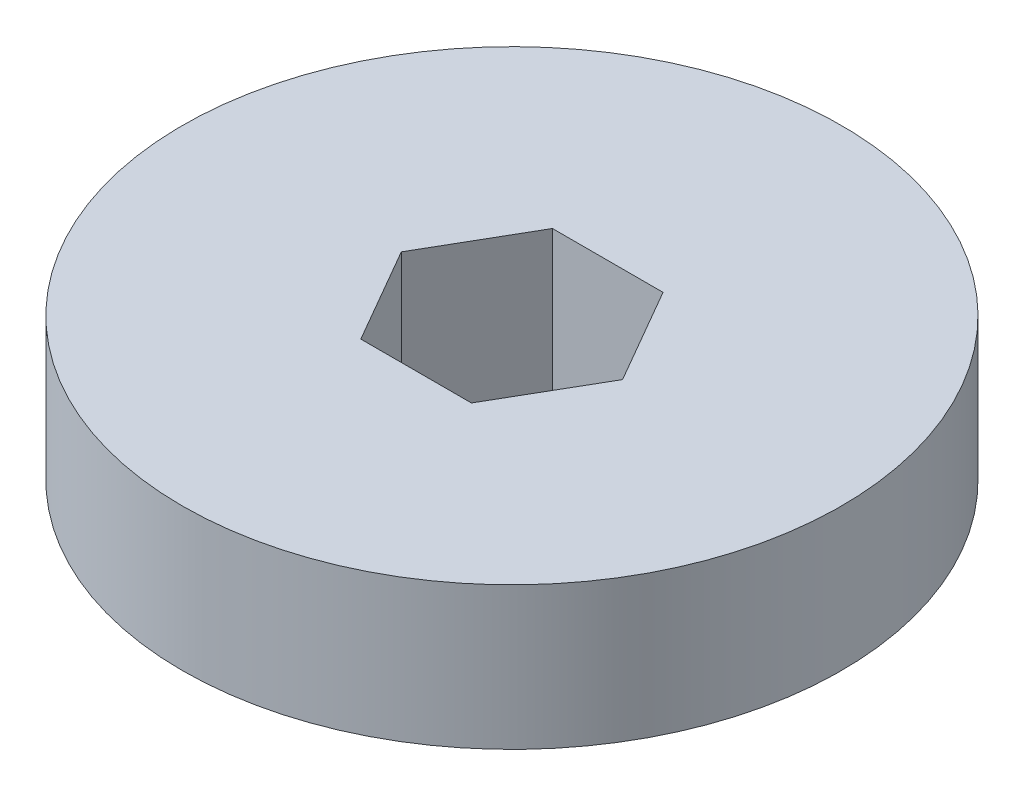
ISO-10303-21;
HEADER;
FILE_DESCRIPTION(('STEP AP214'),'2;1');
FILE_NAME('part.step','',(''),(''),'','','');
FILE_SCHEMA(('AUTOMOTIVE_DESIGN { 1 0 10303 214 1 1 1 1 }'));
ENDSEC;
DATA;
#1=APPLICATION_CONTEXT('core data for automotive mechanical design processes');
#2=APPLICATION_PROTOCOL_DEFINITION('international standard','automotive_design',2000,#1);
#3=PRODUCT_CONTEXT('',#1,'mechanical');
#4=PRODUCT('Part','Part','',(#3));
#5=PRODUCT_RELATED_PRODUCT_CATEGORY('part','',(#4));
#6=PRODUCT_DEFINITION_FORMATION('','',#4);
#7=PRODUCT_DEFINITION_CONTEXT('part definition',#1,'design');
#8=PRODUCT_DEFINITION('design','',#6,#7);
#9=PRODUCT_DEFINITION_SHAPE('','',#8);
#10=(LENGTH_UNIT() NAMED_UNIT(*) SI_UNIT(.MILLI.,.METRE.));
#11=(NAMED_UNIT(*) PLANE_ANGLE_UNIT() SI_UNIT($,.RADIAN.));
#12=(NAMED_UNIT(*) SI_UNIT($,.STERADIAN.) SOLID_ANGLE_UNIT());
#13=UNCERTAINTY_MEASURE_WITH_UNIT(LENGTH_MEASURE(1.E-05),#10,'distance_accuracy_value','');
#14=(GEOMETRIC_REPRESENTATION_CONTEXT(3) GLOBAL_UNCERTAINTY_ASSIGNED_CONTEXT((#13)) GLOBAL_UNIT_ASSIGNED_CONTEXT((#10,
#11,#12)) REPRESENTATION_CONTEXT('',''));
#15=CARTESIAN_POINT('',(0.,0.,0.));
#16=DIRECTION('',(0.,0.,1.));
#17=DIRECTION('',(1.,0.,0.));
#18=AXIS2_PLACEMENT_3D('',#15,#16,#17);
#19=CARTESIAN_POINT('',(0.,9.4488,0.));
#20=DIRECTION('',(0.,1.,0.));
#21=DIRECTION('',(0.,0.,1.));
#22=AXIS2_PLACEMENT_3D('',#19,#20,#21);
#23=PLANE('',#22);
#24=CARTESIAN_POINT('',(0.,9.4488,0.));
#25=DIRECTION('',(0.,1.,0.));
#26=DIRECTION('',(0.,0.,1.));
#27=AXIS2_PLACEMENT_3D('',#24,#25,#26);
#28=CIRCLE('',#27,21.844);
#29=CARTESIAN_POINT('',(0.,9.4488,21.844));
#30=VERTEX_POINT('',#29);
#31=EDGE_CURVE('E11',#30,#30,#28,.T.);
#32=ORIENTED_EDGE('',*,*,#31,.T.);
#33=EDGE_LOOP('',(#32));
#34=FACE_BOUND('',#33,.T.);
#35=DIRECTION('',(-0.5,0.,0.866025403784439));
#36=VECTOR('',#35,1.);
#37=CARTESIAN_POINT('',(-3.66617420935412,9.4488,-6.35));
#38=LINE('',#37,#36);
#39=CARTESIAN_POINT('',(-3.66617420935412,9.4488,-6.35));
#40=VERTEX_POINT('',#39);
#41=CARTESIAN_POINT('',(-7.33234841870825,9.4488,0.));
#42=VERTEX_POINT('',#41);
#43=EDGE_CURVE('E115',#40,#42,#38,.T.);
#44=ORIENTED_EDGE('',*,*,#43,.F.);
#45=DIRECTION('',(-1.,0.,0.));
#46=VECTOR('',#45,1.);
#47=CARTESIAN_POINT('',(3.66617420935413,9.4488,-6.35));
#48=LINE('',#47,#46);
#49=CARTESIAN_POINT('',(3.66617420935413,9.4488,-6.35));
#50=VERTEX_POINT('',#49);
#51=EDGE_CURVE('E106',#50,#40,#48,.T.);
#52=ORIENTED_EDGE('',*,*,#51,.F.);
#53=DIRECTION('',(-0.5,0.,-0.866025403784439));
#54=VECTOR('',#53,1.);
#55=CARTESIAN_POINT('',(7.33234841870825,9.4488,0.));
#56=LINE('',#55,#54);
#57=CARTESIAN_POINT('',(7.33234841870825,9.4488,0.));
#58=VERTEX_POINT('',#57);
#59=EDGE_CURVE('E142',#58,#50,#56,.T.);
#60=ORIENTED_EDGE('',*,*,#59,.F.);
#61=DIRECTION('',(0.5,0.,-0.866025403784438));
#62=VECTOR('',#61,1.);
#63=CARTESIAN_POINT('',(3.66617420935412,9.4488,6.35));
#64=LINE('',#63,#62);
#65=CARTESIAN_POINT('',(3.66617420935412,9.4488,6.35));
#66=VERTEX_POINT('',#65);
#67=EDGE_CURVE('E139',#66,#58,#64,.T.);
#68=ORIENTED_EDGE('',*,*,#67,.F.);
#69=DIRECTION('',(1.,0.,0.));
#70=VECTOR('',#69,1.);
#71=CARTESIAN_POINT('',(-3.66617420935413,9.4488,6.35));
#72=LINE('',#71,#70);
#73=CARTESIAN_POINT('',(-3.66617420935413,9.4488,6.35));
#74=VERTEX_POINT('',#73);
#75=EDGE_CURVE('E134',#74,#66,#72,.T.);
#76=ORIENTED_EDGE('',*,*,#75,.F.);
#77=DIRECTION('',(0.5,0.,0.866025403784439));
#78=VECTOR('',#77,1.);
#79=CARTESIAN_POINT('',(-7.33234841870825,9.4488,0.));
#80=LINE('',#79,#78);
#81=EDGE_CURVE('E128',#42,#74,#80,.T.);
#82=ORIENTED_EDGE('',*,*,#81,.F.);
#83=EDGE_LOOP('',(#44,#52,#60,#68,#76,#82));
#84=FACE_BOUND('',#83,.T.);
#85=ADVANCED_FACE('F40',(#34,#84),#23,.T.);
#86=CARTESIAN_POINT('',(0.,0.,0.));
#87=DIRECTION('',(0.,1.,0.));
#88=DIRECTION('',(0.,0.,1.));
#89=AXIS2_PLACEMENT_3D('',#86,#87,#88);
#90=PLANE('',#89);
#91=CARTESIAN_POINT('',(0.,0.,0.));
#92=DIRECTION('',(0.,1.,0.));
#93=DIRECTION('',(0.,0.,1.));
#94=AXIS2_PLACEMENT_3D('',#91,#92,#93);
#95=CIRCLE('',#94,21.844);
#96=CARTESIAN_POINT('',(0.,0.,21.844));
#97=VERTEX_POINT('',#96);
#98=EDGE_CURVE('E44',#97,#97,#95,.T.);
#99=ORIENTED_EDGE('',*,*,#98,.F.);
#100=EDGE_LOOP('',(#99));
#101=FACE_BOUND('',#100,.T.);
#102=DIRECTION('',(-1.,0.,0.));
#103=VECTOR('',#102,1.);
#104=CARTESIAN_POINT('',(3.66617420935413,0.,-6.35));
#105=LINE('',#104,#103);
#106=CARTESIAN_POINT('',(3.66617420935413,0.,-6.35));
#107=VERTEX_POINT('',#106);
#108=CARTESIAN_POINT('',(-3.66617420935412,0.,-6.35));
#109=VERTEX_POINT('',#108);
#110=EDGE_CURVE('E70',#107,#109,#105,.T.);
#111=ORIENTED_EDGE('',*,*,#110,.T.);
#112=DIRECTION('',(-0.5,0.,0.866025403784439));
#113=VECTOR('',#112,1.);
#114=CARTESIAN_POINT('',(-3.66617420935412,0.,-6.35));
#115=LINE('',#114,#113);
#116=CARTESIAN_POINT('',(-7.33234841870825,0.,0.));
#117=VERTEX_POINT('',#116);
#118=EDGE_CURVE('E122',#109,#117,#115,.T.);
#119=ORIENTED_EDGE('',*,*,#118,.T.);
#120=DIRECTION('',(0.5,0.,0.866025403784439));
#121=VECTOR('',#120,1.);
#122=CARTESIAN_POINT('',(-7.33234841870825,0.,0.));
#123=LINE('',#122,#121);
#124=CARTESIAN_POINT('',(-3.66617420935413,0.,6.35));
#125=VERTEX_POINT('',#124);
#126=EDGE_CURVE('E148',#117,#125,#123,.T.);
#127=ORIENTED_EDGE('',*,*,#126,.T.);
#128=DIRECTION('',(1.,0.,0.));
#129=VECTOR('',#128,1.);
#130=CARTESIAN_POINT('',(-3.66617420935413,0.,6.35));
#131=LINE('',#130,#129);
#132=CARTESIAN_POINT('',(3.66617420935412,0.,6.35));
#133=VERTEX_POINT('',#132);
#134=EDGE_CURVE('E152',#125,#133,#131,.T.);
#135=ORIENTED_EDGE('',*,*,#134,.T.);
#136=DIRECTION('',(0.5,0.,-0.866025403784438));
#137=VECTOR('',#136,1.);
#138=CARTESIAN_POINT('',(3.66617420935412,0.,6.35));
#139=LINE('',#138,#137);
#140=CARTESIAN_POINT('',(7.33234841870825,0.,0.));
#141=VERTEX_POINT('',#140);
#142=EDGE_CURVE('E156',#133,#141,#139,.T.);
#143=ORIENTED_EDGE('',*,*,#142,.T.);
#144=DIRECTION('',(-0.5,0.,-0.866025403784439));
#145=VECTOR('',#144,1.);
#146=CARTESIAN_POINT('',(7.33234841870825,0.,0.));
#147=LINE('',#146,#145);
#148=EDGE_CURVE('E116',#141,#107,#147,.T.);
#149=ORIENTED_EDGE('',*,*,#148,.T.);
#150=EDGE_LOOP('',(#111,#119,#127,#135,#143,#149));
#151=FACE_BOUND('',#150,.T.);
#152=ADVANCED_FACE('F179',(#101,#151),#90,.F.);
#153=CARTESIAN_POINT('',(0.,9.4488,0.));
#154=DIRECTION('',(0.,-1.,0.));
#155=DIRECTION('',(0.,0.,-1.));
#156=AXIS2_PLACEMENT_3D('',#153,#154,#155);
#157=CYLINDRICAL_SURFACE('',#156,21.844);
#158=ORIENTED_EDGE('',*,*,#31,.F.);
#159=EDGE_LOOP('',(#158));
#160=FACE_BOUND('',#159,.T.);
#161=ORIENTED_EDGE('',*,*,#98,.T.);
#162=EDGE_LOOP('',(#161));
#163=FACE_BOUND('',#162,.T.);
#164=ADVANCED_FACE('F42',(#160,#163),#157,.T.);
#165=CARTESIAN_POINT('',(3.66617420935413,9.4488,-6.35));
#166=DIRECTION('',(0.,0.,1.));
#167=DIRECTION('',(1.,0.,0.));
#168=AXIS2_PLACEMENT_3D('',#165,#166,#167);
#169=PLANE('',#168);
#170=ORIENTED_EDGE('',*,*,#110,.F.);
#171=DIRECTION('',(0.,-1.,0.));
#172=VECTOR('',#171,1.);
#173=CARTESIAN_POINT('',(3.66617420935413,9.4488,-6.35));
#174=LINE('',#173,#172);
#175=EDGE_CURVE('E110',#50,#107,#174,.T.);
#176=ORIENTED_EDGE('',*,*,#175,.F.);
#177=ORIENTED_EDGE('',*,*,#51,.T.);
#178=DIRECTION('',(0.,-1.,0.));
#179=VECTOR('',#178,1.);
#180=CARTESIAN_POINT('',(-3.66617420935412,9.4488,-6.35));
#181=LINE('',#180,#179);
#182=EDGE_CURVE('E109',#40,#109,#181,.T.);
#183=ORIENTED_EDGE('',*,*,#182,.T.);
#184=EDGE_LOOP('',(#170,#176,#177,#183));
#185=FACE_BOUND('',#184,.T.);
#186=ADVANCED_FACE('F108',(#185),#169,.T.);
#187=CARTESIAN_POINT('',(-3.66617420935412,9.4488,-6.35));
#188=DIRECTION('',(0.866025403784439,0.,0.5));
#189=DIRECTION('',(0.5,0.,-0.866025403784439));
#190=AXIS2_PLACEMENT_3D('',#187,#188,#189);
#191=PLANE('',#190);
#192=ORIENTED_EDGE('',*,*,#118,.F.);
#193=ORIENTED_EDGE('',*,*,#182,.F.);
#194=ORIENTED_EDGE('',*,*,#43,.T.);
#195=DIRECTION('',(0.,-1.,0.));
#196=VECTOR('',#195,1.);
#197=CARTESIAN_POINT('',(-7.33234841870825,9.4488,0.));
#198=LINE('',#197,#196);
#199=EDGE_CURVE('E124',#42,#117,#198,.T.);
#200=ORIENTED_EDGE('',*,*,#199,.T.);
#201=EDGE_LOOP('',(#192,#193,#194,#200));
#202=FACE_BOUND('',#201,.T.);
#203=ADVANCED_FACE('F119',(#202),#191,.T.);
#204=CARTESIAN_POINT('',(-7.33234841870825,9.4488,0.));
#205=DIRECTION('',(0.866025403784439,0.,-0.5));
#206=DIRECTION('',(-0.5,0.,-0.866025403784439));
#207=AXIS2_PLACEMENT_3D('',#204,#205,#206);
#208=PLANE('',#207);
#209=ORIENTED_EDGE('',*,*,#126,.F.);
#210=ORIENTED_EDGE('',*,*,#199,.F.);
#211=ORIENTED_EDGE('',*,*,#81,.T.);
#212=DIRECTION('',(0.,-1.,0.));
#213=VECTOR('',#212,1.);
#214=CARTESIAN_POINT('',(-3.66617420935413,9.4488,6.35));
#215=LINE('',#214,#213);
#216=EDGE_CURVE('E170',#74,#125,#215,.T.);
#217=ORIENTED_EDGE('',*,*,#216,.T.);
#218=EDGE_LOOP('',(#209,#210,#211,#217));
#219=FACE_BOUND('',#218,.T.);
#220=ADVANCED_FACE('F175',(#219),#208,.T.);
#221=CARTESIAN_POINT('',(-3.66617420935413,9.4488,6.35));
#222=DIRECTION('',(0.,0.,-1.));
#223=DIRECTION('',(-1.,0.,0.));
#224=AXIS2_PLACEMENT_3D('',#221,#222,#223);
#225=PLANE('',#224);
#226=ORIENTED_EDGE('',*,*,#134,.F.);
#227=ORIENTED_EDGE('',*,*,#216,.F.);
#228=ORIENTED_EDGE('',*,*,#75,.T.);
#229=DIRECTION('',(0.,-1.,0.));
#230=VECTOR('',#229,1.);
#231=CARTESIAN_POINT('',(3.66617420935412,9.4488,6.35));
#232=LINE('',#231,#230);
#233=EDGE_CURVE('E167',#66,#133,#232,.T.);
#234=ORIENTED_EDGE('',*,*,#233,.T.);
#235=EDGE_LOOP('',(#226,#227,#228,#234));
#236=FACE_BOUND('',#235,.T.);
#237=ADVANCED_FACE('F187',(#236),#225,.T.);
#238=CARTESIAN_POINT('',(3.66617420935412,9.4488,6.35));
#239=DIRECTION('',(-0.866025403784438,0.,-0.5));
#240=DIRECTION('',(-0.5,0.,0.866025403784439));
#241=AXIS2_PLACEMENT_3D('',#238,#239,#240);
#242=PLANE('',#241);
#243=ORIENTED_EDGE('',*,*,#142,.F.);
#244=ORIENTED_EDGE('',*,*,#233,.F.);
#245=ORIENTED_EDGE('',*,*,#67,.T.);
#246=DIRECTION('',(0.,-1.,0.));
#247=VECTOR('',#246,1.);
#248=CARTESIAN_POINT('',(7.33234841870825,9.4488,0.));
#249=LINE('',#248,#247);
#250=EDGE_CURVE('E59',#58,#141,#249,.T.);
#251=ORIENTED_EDGE('',*,*,#250,.T.);
#252=EDGE_LOOP('',(#243,#244,#245,#251));
#253=FACE_BOUND('',#252,.T.);
#254=ADVANCED_FACE('F185',(#253),#242,.T.);
#255=CARTESIAN_POINT('',(7.33234841870825,9.4488,0.));
#256=DIRECTION('',(-0.866025403784439,0.,0.5));
#257=DIRECTION('',(0.5,0.,0.866025403784439));
#258=AXIS2_PLACEMENT_3D('',#255,#256,#257);
#259=PLANE('',#258);
#260=ORIENTED_EDGE('',*,*,#148,.F.);
#261=ORIENTED_EDGE('',*,*,#250,.F.);
#262=ORIENTED_EDGE('',*,*,#59,.T.);
#263=ORIENTED_EDGE('',*,*,#175,.T.);
#264=EDGE_LOOP('',(#260,#261,#262,#263));
#265=FACE_BOUND('',#264,.T.);
#266=ADVANCED_FACE('F181',(#265),#259,.T.);
#267=CLOSED_SHELL('',(#85,#152,#164,#186,#203,#220,#237,#254,#266));
#268=MANIFOLD_SOLID_BREP('B2',#267);
#269=ADVANCED_BREP_SHAPE_REPRESENTATION('',(#18,#268),#14);
#270=SHAPE_DEFINITION_REPRESENTATION(#9,#269);
ENDSEC;
END-ISO-10303-21;
